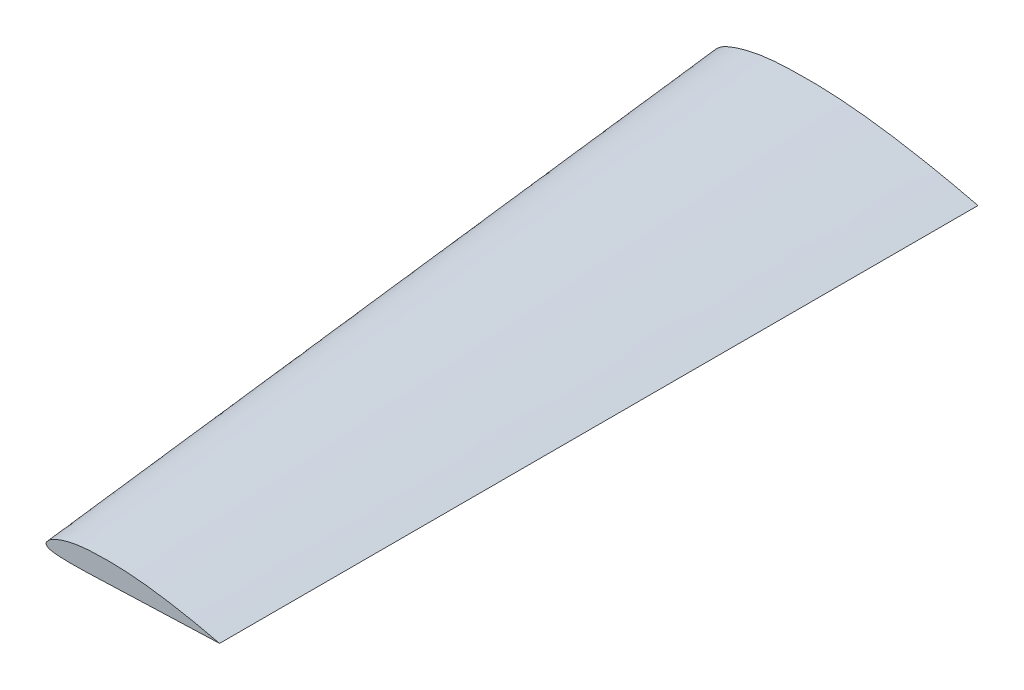
ISO-10303-21;
HEADER;
FILE_DESCRIPTION(('STEP AP214'),'2;1');
FILE_NAME('part.step','',(''),(''),'','','');
FILE_SCHEMA(('AUTOMOTIVE_DESIGN { 1 0 10303 214 1 1 1 1 }'));
ENDSEC;
DATA;
#1=APPLICATION_CONTEXT('core data for automotive mechanical design processes');
#2=APPLICATION_PROTOCOL_DEFINITION('international standard','automotive_design',2000,#1);
#3=PRODUCT_CONTEXT('',#1,'mechanical');
#4=PRODUCT('Part','Part','',(#3));
#5=PRODUCT_RELATED_PRODUCT_CATEGORY('part','',(#4));
#6=PRODUCT_DEFINITION_FORMATION('','',#4);
#7=PRODUCT_DEFINITION_CONTEXT('part definition',#1,'design');
#8=PRODUCT_DEFINITION('design','',#6,#7);
#9=PRODUCT_DEFINITION_SHAPE('','',#8);
#10=(LENGTH_UNIT() NAMED_UNIT(*) SI_UNIT(.MILLI.,.METRE.));
#11=(NAMED_UNIT(*) PLANE_ANGLE_UNIT() SI_UNIT($,.RADIAN.));
#12=(NAMED_UNIT(*) SI_UNIT($,.STERADIAN.) SOLID_ANGLE_UNIT());
#13=UNCERTAINTY_MEASURE_WITH_UNIT(LENGTH_MEASURE(1.E-05),#10,'distance_accuracy_value','');
#14=(GEOMETRIC_REPRESENTATION_CONTEXT(3) GLOBAL_UNCERTAINTY_ASSIGNED_CONTEXT((#13)) GLOBAL_UNIT_ASSIGNED_CONTEXT((#10,
#11,#12)) REPRESENTATION_CONTEXT('',''));
#15=CARTESIAN_POINT('',(0.,0.,0.));
#16=DIRECTION('',(0.,0.,1.));
#17=DIRECTION('',(1.,0.,0.));
#18=AXIS2_PLACEMENT_3D('',#15,#16,#17);
#19=CARTESIAN_POINT('',(114.900829426016,-0.0501642102156497,329.));
#20=DIRECTION('',(0.03670589649599,-0.99932611151837,0.));
#21=DIRECTION('',(-0.99932611151837,-0.03670589649599,0.));
#22=AXIS2_PLACEMENT_3D('',#19,#20,#21);
#23=PLANE('',#22);
#24=DIRECTION('',(-0.99932611151837,-0.03670589649599,0.));
#25=VECTOR('',#24,1.);
#26=CARTESIAN_POINT('',(114.736719522713,-0.056192073447858,329.));
#27=LINE('',#26,#25);
#28=CARTESIAN_POINT('',(114.900829426016,-0.0501642102156497,329.));
#29=VERTEX_POINT('',#28);
#30=CARTESIAN_POINT('',(114.57260961941,-0.0622199366800662,329.));
#31=VERTEX_POINT('',#30);
#32=EDGE_CURVE('E12',#29,#31,#27,.T.);
#33=ORIENTED_EDGE('',*,*,#32,.T.);
#34=DIRECTION('',(-0.00052464922681561,-1.92707065233546E-05,-0.999999862185905));
#35=VECTOR('',#34,1.);
#36=CARTESIAN_POINT('',(114.486304809705,-0.0653899683400331,164.5));
#37=LINE('',#36,#35);
#38=CARTESIAN_POINT('',(114.4,-0.06856,0.));
#39=VERTEX_POINT('',#38);
#40=EDGE_CURVE('E93',#31,#39,#37,.T.);
#41=ORIENTED_EDGE('',*,*,#40,.T.);
#42=DIRECTION('',(-0.99932611151837,-0.0367058964959925,0.));
#43=VECTOR('',#42,1.);
#44=CARTESIAN_POINT('',(114.650414713008,-0.0593621051078248,0.));
#45=LINE('',#44,#43);
#46=CARTESIAN_POINT('',(114.900829426016,-0.0501642102156497,0.));
#47=VERTEX_POINT('',#46);
#48=EDGE_CURVE('E141',#47,#39,#45,.T.);
#49=ORIENTED_EDGE('',*,*,#48,.F.);
#50=DIRECTION('',(0.,0.,-1.));
#51=VECTOR('',#50,1.);
#52=CARTESIAN_POINT('',(114.900829426016,-0.0501642102156497,164.5));
#53=LINE('',#52,#51);
#54=EDGE_CURVE('E123',#29,#47,#53,.T.);
#55=ORIENTED_EDGE('',*,*,#54,.F.);
#56=EDGE_LOOP('',(#33,#41,#49,#55));
#57=FACE_BOUND('',#56,.T.);
#58=ADVANCED_FACE('F82',(#57),#23,.T.);
#59=CARTESIAN_POINT('',(114.57260961941,-0.0622199366800662,329.));
#60=CARTESIAN_POINT('',(114.4,-0.06856,0.));
#61=CARTESIAN_POINT('',(112.977295975491,-0.120816841951953,329.));
#62=CARTESIAN_POINT('',(111.965716629161,-0.157972807713173,0.));
#63=CARTESIAN_POINT('',(109.786644863781,-0.237979796076084,329.));
#64=CARTESIAN_POINT('',(107.097110694278,-0.336751805766281,0.));
#65=CARTESIAN_POINT('',(105.000693099298,-0.413750156151413,329.000000000001));
#66=CARTESIAN_POINT('',(99.7942412380696,-0.604959601121479,0.));
#67=CARTESIAN_POINT('',(100.214728756306,-0.589510986458513,329.));
#68=CARTESIAN_POINT('',(92.4913536383134,-0.8731494297109,0.));
#69=CARTESIAN_POINT('',(96.2264313571632,-0.735983254405373,329.));
#70=CARTESIAN_POINT('',(86.4056226452766,-1.09665710687671,0.));
#71=CARTESIAN_POINT('',(93.0357910844883,-0.85316110543344,329.));
#72=CARTESIAN_POINT('',(81.5370332937189,-1.27545083091915,0.));
#73=CARTESIAN_POINT('',(90.6428111354104,-0.941052950988877,329.));
#74=CARTESIAN_POINT('',(77.885594217603,-1.40956958634636,0.));
#75=CARTESIAN_POINT('',(88.2498328738692,-1.0289616927778,329.));
#76=CARTESIAN_POINT('',(74.2341544850718,-1.5437082159473,0.));
#77=CARTESIAN_POINT('',(85.856852391205,-1.11683664511502,329.));
#78=CARTESIAN_POINT('',(70.5827135432517,-1.67779370490371,0.));
#79=CARTESIAN_POINT('',(83.4638704721177,-1.2046573139067,329.));
#80=CARTESIAN_POINT('',(66.9312695396541,-1.81180573537152,0.));
#81=CARTESIAN_POINT('',(81.0708879975479,-1.29247078457698,329.));
#82=CARTESIAN_POINT('',(63.2798246772732,-1.94578905588669,0.));
#83=CARTESIAN_POINT('',(78.6779074851115,-1.38033351483244,329.));
#84=CARTESIAN_POINT('',(59.6283831410075,-2.07986597687277,0.));
#85=CARTESIAN_POINT('',(76.284934331329,-1.46839890937835,329.));
#86=CARTESIAN_POINT('',(55.9769530860873,-2.21425367726004,0.));
#87=CARTESIAN_POINT('',(73.8919664634316,-1.55660594759836,329.000000000001));
#88=CARTESIAN_POINT('',(52.3255302758724,-2.34883859679651,0.));
#89=CARTESIAN_POINT('',(71.4989899683453,-1.64458072330846,328.999999999999));
#90=CARTESIAN_POINT('',(48.6740949273067,-2.48308328284724,0.));
#91=CARTESIAN_POINT('',(69.105989839964,-1.73190836915481,329.000000000001));
#92=CARTESIAN_POINT('',(45.022623273531,-2.61633760751869,0.));
#93=CARTESIAN_POINT('',(66.7129651493619,-1.81856384168044,328.999999999999));
#94=CARTESIAN_POINT('',(41.3711135439631,-2.74854338410483,0.));
#95=CARTESIAN_POINT('',(64.3199669373025,-1.90594191039954,329.000000000001));
#96=CARTESIAN_POINT('',(37.7196460479609,-2.88191417837728,0.));
#97=CARTESIAN_POINT('',(62.3258668299447,-1.98053661442866,329.));
#98=CARTESIAN_POINT('',(34.6768527696352,-2.99567203272385,0.));
#99=CARTESIAN_POINT('',(60.7306395653596,-2.04158861078398,329.));
#100=CARTESIAN_POINT('',(32.2427036249245,-3.08892865656621,0.));
#101=CARTESIAN_POINT('',(59.5341984389728,-2.0868333620039,329.));
#102=CARTESIAN_POINT('',(30.4170537095853,-3.15787478213016,0.));
#103=CARTESIAN_POINT('',(58.3376895460393,-2.13030150456465,329.));
#104=CARTESIAN_POINT('',(28.5913075746204,-3.22423675912527,0.));
#105=CARTESIAN_POINT('',(57.1410810890218,-2.17088745999478,329.));
#106=CARTESIAN_POINT('',(26.7654048989622,-3.2861862573127,0.));
#107=CARTESIAN_POINT('',(55.9443412703829,-2.20748564982281,329.));
#108=CARTESIAN_POINT('',(24.9393037637721,-3.3420032780021,0.));
#109=CARTESIAN_POINT('',(54.7474529311727,-2.23888966087624,329.));
#110=CARTESIAN_POINT('',(23.1129754350255,-3.38993650770668,0.));
#111=CARTESIAN_POINT('',(53.5504153162138,-2.26397201099151,329.));
#112=CARTESIAN_POINT('',(21.2864190315302,-3.42820995119329,0.));
#113=CARTESIAN_POINT('',(52.353232928687,-2.28124339291768,328.999999999999));
#114=CARTESIAN_POINT('',(19.4596429108321,-3.4545494980358,0.));
#115=CARTESIAN_POINT('',(51.15595355233,-2.288861920351,329.000000000001));
#116=CARTESIAN_POINT('',(17.6327163554305,-3.46619351578578,0.));
#117=CARTESIAN_POINT('',(49.9586406141466,-2.28571853254573,329.));
#118=CARTESIAN_POINT('',(15.8057424311789,-3.46135030596471,0.));
#119=CARTESIAN_POINT('',(48.7614456222737,-2.26913668236569,328.999999999999));
#120=CARTESIAN_POINT('',(13.9789412855685,-3.43617298193985,0.));
#121=CARTESIAN_POINT('',(47.5644880850567,-2.23954580418405,329.000000000001));
#122=CARTESIAN_POINT('',(12.1525159866253,-3.39081697985119,0.));
#123=CARTESIAN_POINT('',(46.3681294391765,-2.19096327836138,328.999999999999));
#124=CARTESIAN_POINT('',(10.3269829850202,-3.31692842661875,0.));
#125=CARTESIAN_POINT('',(45.1723870805993,-2.13077185247814,329.000000000001));
#126=CARTESIAN_POINT('',(8.50241829521622,-3.22500915813475,0.));
#127=CARTESIAN_POINT('',(44.1766473883666,-2.06485136570954,328.999999999999));
#128=CARTESIAN_POINT('',(6.98300428865084,-3.12433212750466,0.));
#129=CARTESIAN_POINT('',(43.3830893437349,-1.97750102636705,329.000000000001));
#130=CARTESIAN_POINT('',(5.77213418222719,-2.99109577573727,0.));
#131=CARTESIAN_POINT('',(42.7903884171788,-1.89255413261195,328.999999999999));
#132=CARTESIAN_POINT('',(4.86771256745936,-2.86147635484054,0.));
#133=CARTESIAN_POINT('',(42.2018621119385,-1.78259761794642,329.000000000001));
#134=CARTESIAN_POINT('',(3.96972156813326,-2.69356724495905,0.));
#135=CARTESIAN_POINT('',(41.6144368512239,-1.66711733291326,328.999999999999));
#136=CARTESIAN_POINT('',(3.07329938019767,-2.5176539368822,0.));
#137=CARTESIAN_POINT('',(41.030721908302,-1.53296410466494,329.000000000001));
#138=CARTESIAN_POINT('',(2.18268391666198,-2.3127837560272,0.));
#139=CARTESIAN_POINT('',(40.5658570608416,-1.34296250191487,328.999999999999));
#140=CARTESIAN_POINT('',(1.47329929331152,-2.02281116106069,0.));
#141=CARTESIAN_POINT('',(40.2328838259331,-1.12111197664618,329.));
#142=CARTESIAN_POINT('',(0.965300946177489,-1.68427874419331,0.));
#143=CARTESIAN_POINT('',(40.0045523416234,-0.926760940944612,329.));
#144=CARTESIAN_POINT('',(0.616853662639164,-1.38773413128347,0.));
#145=CARTESIAN_POINT('',(39.8058884927858,-0.701609182245043,329.));
#146=CARTESIAN_POINT('',(0.313781760209367,-1.04410645837054,0.));
#147=CARTESIAN_POINT('',(39.6506080929225,-0.443706027629307,329.));
#148=CARTESIAN_POINT('',(0.0769541024066916,-0.650538017604325,0.));
#149=CARTESIAN_POINT('',(39.5764905355394,-0.148134503442184,329.));
#150=CARTESIAN_POINT('',(-0.0364245156961572,-0.199715317390292,0.));
#151=CARTESIAN_POINT('',(39.6212379263324,0.152906641389699,329.));
#152=CARTESIAN_POINT('',(0.0320651688817571,0.259740207343021,0.));
#153=CARTESIAN_POINT('',(39.7462731745835,0.426434812966566,329.));
#154=CARTESIAN_POINT('',(0.222717607662432,0.677061995084372,0.));
#155=CARTESIAN_POINT('',(39.9118284437912,0.676489937329452,329.));
#156=CARTESIAN_POINT('',(0.475409900417133,1.05859895915268,0.));
#157=CARTESIAN_POINT('',(40.1020297991035,0.907946183502351,329.));
#158=CARTESIAN_POINT('',(0.765550841982641,1.41183330248373,0.));
#159=CARTESIAN_POINT('',(40.3058904903587,1.12719115072782,329.));
#160=CARTESIAN_POINT('',(1.07673483260303,1.74628416301866,0.));
#161=CARTESIAN_POINT('',(40.5170780992003,1.33935694664796,329.));
#162=CARTESIAN_POINT('',(1.39880128657276,2.07019260086103,0.));
#163=CARTESIAN_POINT('',(40.7305626383487,1.54914088404984,329.));
#164=CARTESIAN_POINT('',(1.72484435432684,2.39003706317112,0.));
#165=CARTESIAN_POINT('',(40.9491748450726,1.75369770525246,329.));
#166=CARTESIAN_POINT('',(2.05806352461083,2.70249872806248,0.));
#167=CARTESIAN_POINT('',(41.2491898335489,2.01693149821586,329.));
#168=CARTESIAN_POINT('',(2.51618795565956,3.10386363754482,0.));
#169=CARTESIAN_POINT('',(41.6433845733717,2.32338414751801,329.));
#170=CARTESIAN_POINT('',(3.11744388388253,3.57170414689077,0.));
#171=CARTESIAN_POINT('',(42.1419159584038,2.65541038243405,329.));
#172=CARTESIAN_POINT('',(3.87827233736804,4.07822471273745,0.));
#173=CARTESIAN_POINT('',(42.6603325762503,2.95527445622198,329.));
#174=CARTESIAN_POINT('',(4.66927623600314,4.53582075141618,0.));
#175=CARTESIAN_POINT('',(43.1920051006209,3.23067304723329,329.));
#176=CARTESIAN_POINT('',(5.48057328365004,4.95603831197717,0.));
#177=CARTESIAN_POINT('',(43.73461712113,3.48384959688034,329.000000000001));
#178=CARTESIAN_POINT('',(6.30853823898846,5.34236268864598,0.));
#179=CARTESIAN_POINT('',(44.2853103695626,3.71876278425974,328.999999999999));
#180=CARTESIAN_POINT('',(7.14883728112551,5.70082045708303,0.));
#181=CARTESIAN_POINT('',(44.842102539349,3.93881445027894,329.));
#182=CARTESIAN_POINT('',(7.99844900100825,6.03659176034702,0.));
#183=CARTESIAN_POINT('',(45.4037436656897,4.14611278204335,329.));
#184=CARTESIAN_POINT('',(8.85544440881743,6.3529290932593,0.));
#185=CARTESIAN_POINT('',(45.9688602827349,4.34370744577013,329.));
#186=CARTESIAN_POINT('',(9.71777798239826,6.65438937250343,0.));
#187=CARTESIAN_POINT('',(46.5371284585512,4.53207887325267,329.));
#188=CARTESIAN_POINT('',(10.5848518324099,6.94191487900306,0.));
#189=CARTESIAN_POINT('',(47.2989015018565,4.77055534918493,329.));
#190=CARTESIAN_POINT('',(11.7472766809127,7.30570333780045,0.));
#191=CARTESIAN_POINT('',(48.2585469423734,5.04413868204417,329.));
#192=CARTESIAN_POINT('',(13.2115681037735,7.72323418873163,0.));
#193=CARTESIAN_POINT('',(49.4194455039909,5.33759135782374,329.));
#194=CARTESIAN_POINT('',(14.9829959141197,8.17097094627978,0.));
#195=CARTESIAN_POINT('',(50.5876889588109,5.60017543141388,329.));
#196=CARTESIAN_POINT('',(16.7656063461902,8.57166989486869,0.));
#197=CARTESIAN_POINT('',(51.7618910786936,5.83463957492898,329.));
#198=CARTESIAN_POINT('',(18.5573221255501,8.92942802521701,0.));
#199=CARTESIAN_POINT('',(52.9413793027427,6.04087523248973,329.));
#200=CARTESIAN_POINT('',(20.357097215315,9.24412694329611,0.));
#201=CARTESIAN_POINT('',(54.1256039736483,6.21798437376885,328.999999999999));
#202=CARTESIAN_POINT('',(22.1641029633317,9.51437922323504,0.));
#203=CARTESIAN_POINT('',(55.7101440829799,6.41328251131465,329.000000000001));
#204=CARTESIAN_POINT('',(24.581947434041,9.81237724369643,0.));
#205=CARTESIAN_POINT('',(57.6983353941993,6.58884014267491,328.999999999999));
#206=CARTESIAN_POINT('',(27.6157220253602,10.0802867880787,0.));
#207=CARTESIAN_POINT('',(60.089648548173,6.7178868839627,329.));
#208=CARTESIAN_POINT('',(31.2646245807487,10.2771026229954,0.));
#209=CARTESIAN_POINT('',(62.4830008435416,6.79713214430168,329.));
#210=CARTESIAN_POINT('',(34.9166302660792,10.3980954427901,0.));
#211=CARTESIAN_POINT('',(64.8771108097576,6.8473589228501,329.));
#212=CARTESIAN_POINT('',(38.5697944561475,10.4747486999319,0.));
#213=CARTESIAN_POINT('',(67.2717857562776,6.85811026179045,329.));
#214=CARTESIAN_POINT('',(42.2238222521298,10.4911444745235,0.));
#215=CARTESIAN_POINT('',(69.6662566295519,6.82456608957842,329.));
#216=CARTESIAN_POINT('',(45.8775382661358,10.4399604287515,0.));
#217=CARTESIAN_POINT('',(72.0595159941657,6.74076018787565,329.));
#218=CARTESIAN_POINT('',(49.5294044274174,10.3120908518743,0.));
#219=CARTESIAN_POINT('',(74.4507854867059,6.61312441778202,329.));
#220=CARTESIAN_POINT('',(53.178236653511,10.1173287938002,0.));
#221=CARTESIAN_POINT('',(76.83962110388,6.44606051592298,329.));
#222=CARTESIAN_POINT('',(56.8233498066736,9.86239123421157,0.));
#223=CARTESIAN_POINT('',(79.2257994806511,6.24485556975728,329.));
#224=CARTESIAN_POINT('',(60.4644197278447,9.55540656456613,0.));
#225=CARTESIAN_POINT('',(81.608883892125,6.00968462430416,329.));
#226=CARTESIAN_POINT('',(64.1007467162242,9.19649996426467,0.));
#227=CARTESIAN_POINT('',(83.9884067169117,5.74098583428185,329.));
#228=CARTESIAN_POINT('',(67.7316796667099,8.78660201096427,0.));
#229=CARTESIAN_POINT('',(86.3639430060132,5.43895442797606,329.));
#230=CARTESIAN_POINT('',(71.35645846618,8.32555431852534,0.));
#231=CARTESIAN_POINT('',(88.7353798020637,5.10654326179853,329.));
#232=CARTESIAN_POINT('',(74.9750949806674,7.81858317834956,0.));
#233=CARTESIAN_POINT('',(91.1029623317014,4.74754064005611,329.));
#234=CARTESIAN_POINT('',(78.587697519638,7.27053006377924,0.));
#235=CARTESIAN_POINT('',(93.4669358215645,4.36573486705565,329.));
#236=CARTESIAN_POINT('',(82.1949389593251,6.68807069894766,0.));
#237=CARTESIAN_POINT('',(96.6140720283502,3.82758553402491,329.));
#238=CARTESIAN_POINT('',(86.9971156579425,5.86690602257278,0.));
#239=CARTESIAN_POINT('',(100.5389082124,3.10287561201863,329.));
#240=CARTESIAN_POINT('',(92.98602152733,4.761034593382,0.));
#241=CARTESIAN_POINT('',(105.23248636945,2.15016018644571,329.));
#242=CARTESIAN_POINT('',(100.147932525585,3.30731157548085,0.));
#243=CARTESIAN_POINT('',(109.912024284167,1.13032636467303,329.));
#244=CARTESIAN_POINT('',(107.288427475213,1.75113882040688,0.));
#245=CARTESIAN_POINT('',(113.019270648536,0.395869046271625,329.));
#246=CARTESIAN_POINT('',(112.029765632302,0.630436336958154,0.));
#247=CARTESIAN_POINT('',(114.600066449668,0.0211332115694607,329.));
#248=CARTESIAN_POINT('',(114.441896278871,0.0586282700306697,0.));
#249=CARTESIAN_POINT('',(114.654664571062,0.00819044402219781,329.));
#250=CARTESIAN_POINT('',(114.525207356504,0.03887894744609,0.));
#251=CARTESIAN_POINT('',(114.736719522714,-0.0112611073904201,329.));
#252=CARTESIAN_POINT('',(114.650414713008,0.00919789489218184,0.));
#253=CARTESIAN_POINT('',(114.818774474365,-0.0307126588030327,329.));
#254=CARTESIAN_POINT('',(114.775622069512,-0.0204831576617346,0.));
#255=CARTESIAN_POINT('',(114.873477775466,-0.0436803597447778,329.));
#256=CARTESIAN_POINT('',(114.859093640515,-0.0402705260310117,0.));
#257=CARTESIAN_POINT('',(114.900829426016,-0.0501642102156497,329.));
#258=CARTESIAN_POINT('',(114.900829426016,-0.0501642102156497,0.));
#259=B_SPLINE_SURFACE_WITH_KNOTS('',3,1,((#59,#60),(#61,#62),(#63,#64),(#65,#66),(#67,#68),(#69,
#70),(#71,#72),(#73,#74),(#75,#76),(#77,#78),(#79,#80),(#81,#82),(#83,#84),(#85,#86),(#87,#88),
(#89,#90),(#91,#92),(#93,#94),(#95,#96),(#97,#98),(#99,#100),(#101,#102),(#103,#104),(#105,
#106),(#107,#108),(#109,#110),(#111,#112),(#113,#114),(#115,#116),(#117,#118),(#119,#120),(#121,
#122),(#123,#124),(#125,#126),(#127,#128),(#129,#130),(#131,#132),(#133,#134),(#135,#136),(#137,
#138),(#139,#140),(#141,#142),(#143,#144),(#145,#146),(#147,#148),(#149,#150),(#151,#152),(#153,
#154),(#155,#156),(#157,#158),(#159,#160),(#161,#162),(#163,#164),(#165,#166),(#167,#168),(#169,
#170),(#171,#172),(#173,#174),(#175,#176),(#177,#178),(#179,#180),(#181,#182),(#183,#184),(#185,
#186),(#187,#188),(#189,#190),(#191,#192),(#193,#194),(#195,#196),(#197,#198),(#199,#200),(#201,
#202),(#203,#204),(#205,#206),(#207,#208),(#209,#210),(#211,#212),(#213,#214),(#215,#216),(#217,
#218),(#219,#220),(#221,#222),(#223,#224),(#225,#226),(#227,#228),(#229,#230),(#231,#232),(#233,
#234),(#235,#236),(#237,#238),(#239,#240),(#241,#242),(#243,#244),(#245,#246),(#247,#248),(#249,
#250),(#251,#252),(#253,#254),(#255,#256),(#257,#258)),.UNSPECIFIED.,.F.,.F.,.F.,(4,1,1,1,1,1,1,
1,1,1,1,1,1,1,1,1,1,1,1,1,1,1,1,1,1,1,1,1,1,1,1,1,1,1,1,1,1,1,1,1,1,1,1,1,1,1,1,1,1,1,1,1,1,1,1,
1,1,1,1,1,1,1,1,1,1,1,1,1,1,1,1,1,1,1,1,1,1,1,1,1,1,1,1,1,1,1,1,1,1,1,1,1,2,1,1,1,4),(2,2),(0.,
0.0311811053211745,0.0623622106423489,0.0935433159635234,0.124724421284698,0.140314973945285,
0.155905526605872,0.17149607926646,0.187086631927047,0.202677184587634,0.218267737248221,
0.233858289908809,0.249448842569396,0.265039395229983,0.28062994789057,0.296220500551158,
0.311811053211745,0.327401605872332,0.342992158532919,0.350787434863213,0.358582711193506,
0.3663779875238,0.374173263854094,0.381968540184387,0.389763816514681,0.397559092844974,
0.405354369175268,0.413149645505562,0.420944921835855,0.428740198166149,0.436535474496443,
0.444330750826736,0.45212602715703,0.459921303487323,0.46381894165247,0.467716579817617,
0.471614217982764,0.475511856147911,0.479409494313058,0.483307132478204,0.485255951560778,
0.487204770643351,0.489153589725925,0.491102408808498,0.493051227891071,0.495000046973645,
0.496948866056218,0.498897685138791,0.500846504221365,0.502795323303939,0.504744142386512,
0.506692961469085,0.508641780551659,0.510590599634232,0.514488237799379,0.518385875964525,
0.522283514129673,0.526181152294819,0.530078790459966,0.533976428625113,0.53787406679026,
0.541771704955407,0.545669343120553,0.5495669812857,0.553464619450847,0.561259895781141,
0.569055172111434,0.576850448441728,0.584645724772021,0.592441001102315,0.600236277432609,
0.608031553762902,0.62362210642349,0.639212659084077,0.654803211744664,0.670393764405251,
0.685984317065839,0.701574869726425,0.717165422387013,0.7327559750476,0.748346527708187,
0.763937080368774,0.779527633029362,0.795118185689949,0.810708738350536,0.826299291011123,
0.841889843671711,0.857480396332298,0.873070948992885,0.90425205431406,0.935433159635234,
0.966614264956409,0.997795370277583,0.998346527708187,0.998897685138791,0.999448842569396,1.),
(0.,1.),.UNSPECIFIED.);
#260=CARTESIAN_POINT('',(114.57260961941,-0.0622199366800662,329.));
#261=CARTESIAN_POINT('',(112.977295975491,-0.120816841951953,329.));
#262=CARTESIAN_POINT('',(109.786644863781,-0.237979796076084,329.));
#263=CARTESIAN_POINT('',(105.000693099298,-0.413750156151413,329.000000000001));
#264=CARTESIAN_POINT('',(100.214728756306,-0.589510986458513,329.));
#265=CARTESIAN_POINT('',(96.2264313571632,-0.735983254405373,329.));
#266=CARTESIAN_POINT('',(93.0357910844883,-0.85316110543344,329.));
#267=CARTESIAN_POINT('',(90.6428111354104,-0.941052950988877,329.));
#268=CARTESIAN_POINT('',(88.2498328738692,-1.0289616927778,329.));
#269=CARTESIAN_POINT('',(85.856852391205,-1.11683664511502,329.));
#270=CARTESIAN_POINT('',(83.4638704721177,-1.2046573139067,329.));
#271=CARTESIAN_POINT('',(81.0708879975479,-1.29247078457698,329.));
#272=CARTESIAN_POINT('',(78.6779074851115,-1.38033351483244,329.));
#273=CARTESIAN_POINT('',(76.284934331329,-1.46839890937835,329.));
#274=CARTESIAN_POINT('',(73.8919664634316,-1.55660594759836,329.000000000001));
#275=CARTESIAN_POINT('',(71.4989899683453,-1.64458072330846,328.999999999999));
#276=CARTESIAN_POINT('',(69.105989839964,-1.73190836915481,329.000000000001));
#277=CARTESIAN_POINT('',(66.7129651493619,-1.81856384168044,328.999999999999));
#278=CARTESIAN_POINT('',(64.3199669373025,-1.90594191039954,329.000000000001));
#279=CARTESIAN_POINT('',(62.3258668299447,-1.98053661442866,329.));
#280=CARTESIAN_POINT('',(60.7306395653596,-2.04158861078398,329.));
#281=CARTESIAN_POINT('',(59.5341984389728,-2.0868333620039,329.));
#282=CARTESIAN_POINT('',(58.3376895460393,-2.13030150456465,329.));
#283=CARTESIAN_POINT('',(57.1410810890218,-2.17088745999478,329.));
#284=CARTESIAN_POINT('',(55.9443412703829,-2.20748564982281,329.));
#285=CARTESIAN_POINT('',(54.7474529311727,-2.23888966087624,329.));
#286=CARTESIAN_POINT('',(53.5504153162138,-2.26397201099151,329.));
#287=CARTESIAN_POINT('',(52.353232928687,-2.28124339291768,328.999999999999));
#288=CARTESIAN_POINT('',(51.15595355233,-2.288861920351,329.000000000001));
#289=CARTESIAN_POINT('',(49.9586406141466,-2.28571853254573,329.));
#290=CARTESIAN_POINT('',(48.7614456222737,-2.26913668236569,328.999999999999));
#291=CARTESIAN_POINT('',(47.5644880850567,-2.23954580418405,329.000000000001));
#292=CARTESIAN_POINT('',(46.3681294391765,-2.19096327836138,328.999999999999));
#293=CARTESIAN_POINT('',(45.1723870805993,-2.13077185247814,329.000000000001));
#294=CARTESIAN_POINT('',(44.1766473883666,-2.06485136570954,328.999999999999));
#295=CARTESIAN_POINT('',(43.3830893437349,-1.97750102636705,329.000000000001));
#296=CARTESIAN_POINT('',(42.7903884171788,-1.89255413261195,328.999999999999));
#297=CARTESIAN_POINT('',(42.2018621119385,-1.78259761794642,329.000000000001));
#298=CARTESIAN_POINT('',(41.6144368512239,-1.66711733291326,328.999999999999));
#299=CARTESIAN_POINT('',(41.030721908302,-1.53296410466494,329.000000000001));
#300=CARTESIAN_POINT('',(40.5658570608416,-1.34296250191487,328.999999999999));
#301=CARTESIAN_POINT('',(40.2328838259331,-1.12111197664618,329.));
#302=CARTESIAN_POINT('',(40.0045523416234,-0.926760940944612,329.));
#303=CARTESIAN_POINT('',(39.8058884927858,-0.701609182245043,329.));
#304=CARTESIAN_POINT('',(39.6506080929225,-0.443706027629307,329.));
#305=CARTESIAN_POINT('',(39.5764905355394,-0.148134503442184,329.));
#306=CARTESIAN_POINT('',(39.6212379263324,0.152906641389699,329.));
#307=CARTESIAN_POINT('',(39.7462731745835,0.426434812966566,329.));
#308=CARTESIAN_POINT('',(39.9118284437912,0.676489937329452,329.));
#309=CARTESIAN_POINT('',(40.1020297991035,0.907946183502351,329.));
#310=CARTESIAN_POINT('',(40.3058904903587,1.12719115072782,329.));
#311=CARTESIAN_POINT('',(40.5170780992003,1.33935694664796,329.));
#312=CARTESIAN_POINT('',(40.7305626383487,1.54914088404984,329.));
#313=CARTESIAN_POINT('',(40.9491748450726,1.75369770525246,329.));
#314=CARTESIAN_POINT('',(41.2491898335489,2.01693149821586,329.));
#315=CARTESIAN_POINT('',(41.6433845733717,2.32338414751801,329.));
#316=CARTESIAN_POINT('',(42.1419159584038,2.65541038243405,329.));
#317=CARTESIAN_POINT('',(42.6603325762503,2.95527445622198,329.));
#318=CARTESIAN_POINT('',(43.1920051006209,3.23067304723329,329.));
#319=CARTESIAN_POINT('',(43.73461712113,3.48384959688034,329.000000000001));
#320=CARTESIAN_POINT('',(44.2853103695626,3.71876278425974,328.999999999999));
#321=CARTESIAN_POINT('',(44.842102539349,3.93881445027894,329.));
#322=CARTESIAN_POINT('',(45.4037436656897,4.14611278204335,329.));
#323=CARTESIAN_POINT('',(45.9688602827349,4.34370744577013,329.));
#324=CARTESIAN_POINT('',(46.5371284585512,4.53207887325267,329.));
#325=CARTESIAN_POINT('',(47.2989015018565,4.77055534918493,329.));
#326=CARTESIAN_POINT('',(48.2585469423734,5.04413868204417,329.));
#327=CARTESIAN_POINT('',(49.4194455039909,5.33759135782374,329.));
#328=CARTESIAN_POINT('',(50.5876889588109,5.60017543141388,329.));
#329=CARTESIAN_POINT('',(51.7618910786936,5.83463957492898,329.));
#330=CARTESIAN_POINT('',(52.9413793027427,6.04087523248973,329.));
#331=CARTESIAN_POINT('',(54.1256039736483,6.21798437376885,328.999999999999));
#332=CARTESIAN_POINT('',(55.7101440829799,6.41328251131465,329.000000000001));
#333=CARTESIAN_POINT('',(57.6983353941993,6.58884014267491,328.999999999999));
#334=CARTESIAN_POINT('',(60.089648548173,6.7178868839627,329.));
#335=CARTESIAN_POINT('',(62.4830008435416,6.79713214430168,329.));
#336=CARTESIAN_POINT('',(64.8771108097576,6.8473589228501,329.));
#337=CARTESIAN_POINT('',(67.2717857562776,6.85811026179045,329.));
#338=CARTESIAN_POINT('',(69.6662566295519,6.82456608957842,329.));
#339=CARTESIAN_POINT('',(72.0595159941657,6.74076018787565,329.));
#340=CARTESIAN_POINT('',(74.4507854867059,6.61312441778202,329.));
#341=CARTESIAN_POINT('',(76.83962110388,6.44606051592298,329.));
#342=CARTESIAN_POINT('',(79.2257994806511,6.24485556975728,329.));
#343=CARTESIAN_POINT('',(81.608883892125,6.00968462430416,329.));
#344=CARTESIAN_POINT('',(83.9884067169117,5.74098583428185,329.));
#345=CARTESIAN_POINT('',(86.3639430060132,5.43895442797606,329.));
#346=CARTESIAN_POINT('',(88.7353798020637,5.10654326179853,329.));
#347=CARTESIAN_POINT('',(91.1029623317014,4.74754064005611,329.));
#348=CARTESIAN_POINT('',(93.4669358215645,4.36573486705565,329.));
#349=CARTESIAN_POINT('',(96.6140720283502,3.82758553402491,329.));
#350=CARTESIAN_POINT('',(100.5389082124,3.10287561201863,329.));
#351=CARTESIAN_POINT('',(105.23248636945,2.15016018644571,329.));
#352=CARTESIAN_POINT('',(109.912024284167,1.13032636467303,329.));
#353=CARTESIAN_POINT('',(113.019270648536,0.395869046271625,329.));
#354=CARTESIAN_POINT('',(114.600066449668,0.0211332115694607,329.));
#355=CARTESIAN_POINT('',(114.654664571062,0.00819044402219781,329.));
#356=CARTESIAN_POINT('',(114.736719522714,-0.0112611073904201,329.));
#357=CARTESIAN_POINT('',(114.818774474365,-0.0307126588030327,329.));
#358=CARTESIAN_POINT('',(114.873477775466,-0.0436803597447778,329.));
#359=CARTESIAN_POINT('',(114.900829426016,-0.0501642102156497,329.));
#360=B_SPLINE_CURVE_WITH_KNOTS('',3,(#260,#261,#262,#263,#264,#265,#266,#267,#268,#269,#270,
#271,#272,#273,#274,#275,#276,#277,#278,#279,#280,#281,#282,#283,#284,#285,#286,#287,#288,#289,
#290,#291,#292,#293,#294,#295,#296,#297,#298,#299,#300,#301,#302,#303,#304,#305,#306,#307,#308,
#309,#310,#311,#312,#313,#314,#315,#316,#317,#318,#319,#320,#321,#322,#323,#324,#325,#326,#327,
#328,#329,#330,#331,#332,#333,#334,#335,#336,#337,#338,#339,#340,#341,#342,#343,#344,#345,#346,
#347,#348,#349,#350,#351,#352,#353,#354,#355,#356,#357,#358,#359),.UNSPECIFIED.,.F.,.F.,(4,1,1,
1,1,1,1,1,1,1,1,1,1,1,1,1,1,1,1,1,1,1,1,1,1,1,1,1,1,1,1,1,1,1,1,1,1,1,1,1,1,1,1,1,1,1,1,1,1,1,1,
1,1,1,1,1,1,1,1,1,1,1,1,1,1,1,1,1,1,1,1,1,1,1,1,1,1,1,1,1,1,1,1,1,1,1,1,1,1,1,1,1,2,1,1,1,4),
(0.,0.0311811053211745,0.0623622106423489,0.0935433159635234,0.124724421284698,
0.140314973945285,0.155905526605872,0.17149607926646,0.187086631927047,0.202677184587634,
0.218267737248221,0.233858289908809,0.249448842569396,0.265039395229983,0.28062994789057,
0.296220500551158,0.311811053211745,0.327401605872332,0.342992158532919,0.350787434863213,
0.358582711193506,0.3663779875238,0.374173263854094,0.381968540184387,0.389763816514681,
0.397559092844974,0.405354369175268,0.413149645505562,0.420944921835855,0.428740198166149,
0.436535474496443,0.444330750826736,0.45212602715703,0.459921303487323,0.46381894165247,
0.467716579817617,0.471614217982764,0.475511856147911,0.479409494313058,0.483307132478204,
0.485255951560778,0.487204770643351,0.489153589725925,0.491102408808498,0.493051227891071,
0.495000046973645,0.496948866056218,0.498897685138791,0.500846504221365,0.502795323303939,
0.504744142386512,0.506692961469085,0.508641780551659,0.510590599634232,0.514488237799379,
0.518385875964525,0.522283514129673,0.526181152294819,0.530078790459966,0.533976428625113,
0.53787406679026,0.541771704955407,0.545669343120553,0.5495669812857,0.553464619450847,
0.561259895781141,0.569055172111434,0.576850448441728,0.584645724772021,0.592441001102315,
0.600236277432609,0.608031553762902,0.62362210642349,0.639212659084077,0.654803211744664,
0.670393764405251,0.685984317065839,0.701574869726425,0.717165422387013,0.7327559750476,
0.748346527708187,0.763937080368774,0.779527633029362,0.795118185689949,0.810708738350536,
0.826299291011123,0.841889843671711,0.857480396332298,0.873070948992885,0.90425205431406,
0.935433159635234,0.966614264956409,0.997795370277583,0.998346527708187,0.998897685138791,
0.999448842569396,1.),.UNSPECIFIED.);
#361=CARTESIAN_POINT('',(114.572609618683,0.027641995607248,329.));
#362=VERTEX_POINT('',#361);
#363=EDGE_CURVE('E126',#31,#362,#360,.T.);
#364=DIRECTION('',(0.97303377141832,-0.230662696766167,0.));
#365=VECTOR('',#364,1.);
#366=CARTESIAN_POINT('',(114.57260961941,0.0276419954348088,329.));
#367=LINE('',#366,#365);
#368=EDGE_CURVE('E110',#362,#29,#367,.T.);
#369=DIRECTION('',(0.973033771418316,-0.230662696766182,0.));
#370=VECTOR('',#369,1.);
#371=CARTESIAN_POINT('',(114.4,0.06856,0.));
#372=LINE('',#371,#370);
#373=CARTESIAN_POINT('',(114.39999999889,0.0685600002631364,0.));
#374=VERTEX_POINT('',#373);
#375=EDGE_CURVE('E101',#374,#47,#372,.T.);
#376=CARTESIAN_POINT('',(114.4,-0.06856,0.));
#377=CARTESIAN_POINT('',(111.965716629161,-0.157972807713173,0.));
#378=CARTESIAN_POINT('',(107.097110694278,-0.336751805766281,0.));
#379=CARTESIAN_POINT('',(99.7942412380696,-0.604959601121479,0.));
#380=CARTESIAN_POINT('',(92.4913536383134,-0.8731494297109,0.));
#381=CARTESIAN_POINT('',(86.4056226452766,-1.09665710687671,0.));
#382=CARTESIAN_POINT('',(81.5370332937189,-1.27545083091915,0.));
#383=CARTESIAN_POINT('',(77.885594217603,-1.40956958634636,0.));
#384=CARTESIAN_POINT('',(74.2341544850718,-1.5437082159473,0.));
#385=CARTESIAN_POINT('',(70.5827135432517,-1.67779370490371,0.));
#386=CARTESIAN_POINT('',(66.9312695396541,-1.81180573537152,0.));
#387=CARTESIAN_POINT('',(63.2798246772732,-1.94578905588669,0.));
#388=CARTESIAN_POINT('',(59.6283831410075,-2.07986597687277,0.));
#389=CARTESIAN_POINT('',(55.9769530860873,-2.21425367726004,0.));
#390=CARTESIAN_POINT('',(52.3255302758724,-2.34883859679651,0.));
#391=CARTESIAN_POINT('',(48.6740949273067,-2.48308328284724,0.));
#392=CARTESIAN_POINT('',(45.022623273531,-2.61633760751869,0.));
#393=CARTESIAN_POINT('',(41.3711135439631,-2.74854338410483,0.));
#394=CARTESIAN_POINT('',(37.7196460479609,-2.88191417837728,0.));
#395=CARTESIAN_POINT('',(34.6768527696352,-2.99567203272385,0.));
#396=CARTESIAN_POINT('',(32.2427036249245,-3.08892865656621,0.));
#397=CARTESIAN_POINT('',(30.4170537095853,-3.15787478213016,0.));
#398=CARTESIAN_POINT('',(28.5913075746204,-3.22423675912527,0.));
#399=CARTESIAN_POINT('',(26.7654048989622,-3.2861862573127,0.));
#400=CARTESIAN_POINT('',(24.9393037637721,-3.3420032780021,0.));
#401=CARTESIAN_POINT('',(23.1129754350255,-3.38993650770668,0.));
#402=CARTESIAN_POINT('',(21.2864190315302,-3.42820995119329,0.));
#403=CARTESIAN_POINT('',(19.4596429108321,-3.4545494980358,0.));
#404=CARTESIAN_POINT('',(17.6327163554305,-3.46619351578578,0.));
#405=CARTESIAN_POINT('',(15.8057424311789,-3.46135030596471,0.));
#406=CARTESIAN_POINT('',(13.9789412855685,-3.43617298193985,0.));
#407=CARTESIAN_POINT('',(12.1525159866253,-3.39081697985119,0.));
#408=CARTESIAN_POINT('',(10.3269829850202,-3.31692842661875,0.));
#409=CARTESIAN_POINT('',(8.50241829521622,-3.22500915813475,0.));
#410=CARTESIAN_POINT('',(6.98300428865084,-3.12433212750466,0.));
#411=CARTESIAN_POINT('',(5.77213418222719,-2.99109577573727,0.));
#412=CARTESIAN_POINT('',(4.86771256745936,-2.86147635484054,0.));
#413=CARTESIAN_POINT('',(3.96972156813326,-2.69356724495905,0.));
#414=CARTESIAN_POINT('',(3.07329938019767,-2.5176539368822,0.));
#415=CARTESIAN_POINT('',(2.18268391666198,-2.3127837560272,0.));
#416=CARTESIAN_POINT('',(1.47329929331152,-2.02281116106069,0.));
#417=CARTESIAN_POINT('',(0.965300946177489,-1.68427874419331,0.));
#418=CARTESIAN_POINT('',(0.616853662639164,-1.38773413128347,0.));
#419=CARTESIAN_POINT('',(0.313781760209367,-1.04410645837054,0.));
#420=CARTESIAN_POINT('',(0.0769541024066916,-0.650538017604325,0.));
#421=CARTESIAN_POINT('',(-0.0364245156961572,-0.199715317390292,0.));
#422=CARTESIAN_POINT('',(0.0320651688817571,0.259740207343021,0.));
#423=CARTESIAN_POINT('',(0.222717607662432,0.677061995084372,0.));
#424=CARTESIAN_POINT('',(0.475409900417133,1.05859895915268,0.));
#425=CARTESIAN_POINT('',(0.765550841982641,1.41183330248373,0.));
#426=CARTESIAN_POINT('',(1.07673483260303,1.74628416301866,0.));
#427=CARTESIAN_POINT('',(1.39880128657276,2.07019260086103,0.));
#428=CARTESIAN_POINT('',(1.72484435432684,2.39003706317112,0.));
#429=CARTESIAN_POINT('',(2.05806352461083,2.70249872806248,0.));
#430=CARTESIAN_POINT('',(2.51618795565956,3.10386363754482,0.));
#431=CARTESIAN_POINT('',(3.11744388388253,3.57170414689077,0.));
#432=CARTESIAN_POINT('',(3.87827233736804,4.07822471273745,0.));
#433=CARTESIAN_POINT('',(4.66927623600314,4.53582075141618,0.));
#434=CARTESIAN_POINT('',(5.48057328365004,4.95603831197717,0.));
#435=CARTESIAN_POINT('',(6.30853823898846,5.34236268864598,0.));
#436=CARTESIAN_POINT('',(7.14883728112551,5.70082045708303,0.));
#437=CARTESIAN_POINT('',(7.99844900100825,6.03659176034702,0.));
#438=CARTESIAN_POINT('',(8.85544440881743,6.3529290932593,0.));
#439=CARTESIAN_POINT('',(9.71777798239826,6.65438937250343,0.));
#440=CARTESIAN_POINT('',(10.5848518324099,6.94191487900306,0.));
#441=CARTESIAN_POINT('',(11.7472766809127,7.30570333780045,0.));
#442=CARTESIAN_POINT('',(13.2115681037735,7.72323418873163,0.));
#443=CARTESIAN_POINT('',(14.9829959141197,8.17097094627978,0.));
#444=CARTESIAN_POINT('',(16.7656063461902,8.57166989486869,0.));
#445=CARTESIAN_POINT('',(18.5573221255501,8.92942802521701,0.));
#446=CARTESIAN_POINT('',(20.357097215315,9.24412694329611,0.));
#447=CARTESIAN_POINT('',(22.1641029633317,9.51437922323504,0.));
#448=CARTESIAN_POINT('',(24.581947434041,9.81237724369643,0.));
#449=CARTESIAN_POINT('',(27.6157220253602,10.0802867880787,0.));
#450=CARTESIAN_POINT('',(31.2646245807487,10.2771026229954,0.));
#451=CARTESIAN_POINT('',(34.9166302660792,10.3980954427901,0.));
#452=CARTESIAN_POINT('',(38.5697944561475,10.4747486999319,0.));
#453=CARTESIAN_POINT('',(42.2238222521298,10.4911444745235,0.));
#454=CARTESIAN_POINT('',(45.8775382661358,10.4399604287515,0.));
#455=CARTESIAN_POINT('',(49.5294044274174,10.3120908518743,0.));
#456=CARTESIAN_POINT('',(53.178236653511,10.1173287938002,0.));
#457=CARTESIAN_POINT('',(56.8233498066736,9.86239123421157,0.));
#458=CARTESIAN_POINT('',(60.4644197278447,9.55540656456613,0.));
#459=CARTESIAN_POINT('',(64.1007467162242,9.19649996426467,0.));
#460=CARTESIAN_POINT('',(67.7316796667099,8.78660201096427,0.));
#461=CARTESIAN_POINT('',(71.35645846618,8.32555431852534,0.));
#462=CARTESIAN_POINT('',(74.9750949806674,7.81858317834956,0.));
#463=CARTESIAN_POINT('',(78.587697519638,7.27053006377924,0.));
#464=CARTESIAN_POINT('',(82.1949389593251,6.68807069894766,0.));
#465=CARTESIAN_POINT('',(86.9971156579425,5.86690602257278,0.));
#466=CARTESIAN_POINT('',(92.98602152733,4.761034593382,0.));
#467=CARTESIAN_POINT('',(100.147932525585,3.30731157548085,0.));
#468=CARTESIAN_POINT('',(107.288427475213,1.75113882040688,0.));
#469=CARTESIAN_POINT('',(112.029765632302,0.630436336958154,0.));
#470=CARTESIAN_POINT('',(114.441896278871,0.0586282700306697,0.));
#471=CARTESIAN_POINT('',(114.525207356504,0.03887894744609,0.));
#472=CARTESIAN_POINT('',(114.650414713008,0.00919789489218184,0.));
#473=CARTESIAN_POINT('',(114.775622069512,-0.0204831576617346,0.));
#474=CARTESIAN_POINT('',(114.859093640515,-0.0402705260310117,0.));
#475=CARTESIAN_POINT('',(114.900829426016,-0.0501642102156497,0.));
#476=B_SPLINE_CURVE_WITH_KNOTS('',3,(#376,#377,#378,#379,#380,#381,#382,#383,#384,#385,#386,
#387,#388,#389,#390,#391,#392,#393,#394,#395,#396,#397,#398,#399,#400,#401,#402,#403,#404,#405,
#406,#407,#408,#409,#410,#411,#412,#413,#414,#415,#416,#417,#418,#419,#420,#421,#422,#423,#424,
#425,#426,#427,#428,#429,#430,#431,#432,#433,#434,#435,#436,#437,#438,#439,#440,#441,#442,#443,
#444,#445,#446,#447,#448,#449,#450,#451,#452,#453,#454,#455,#456,#457,#458,#459,#460,#461,#462,
#463,#464,#465,#466,#467,#468,#469,#470,#471,#472,#473,#474,#475),.UNSPECIFIED.,.F.,.F.,(4,1,1,
1,1,1,1,1,1,1,1,1,1,1,1,1,1,1,1,1,1,1,1,1,1,1,1,1,1,1,1,1,1,1,1,1,1,1,1,1,1,1,1,1,1,1,1,1,1,1,1,
1,1,1,1,1,1,1,1,1,1,1,1,1,1,1,1,1,1,1,1,1,1,1,1,1,1,1,1,1,1,1,1,1,1,1,1,1,1,1,1,1,2,1,1,1,4),
(0.,0.0311811053211745,0.0623622106423489,0.0935433159635234,0.124724421284698,
0.140314973945285,0.155905526605872,0.17149607926646,0.187086631927047,0.202677184587634,
0.218267737248221,0.233858289908809,0.249448842569396,0.265039395229983,0.28062994789057,
0.296220500551158,0.311811053211745,0.327401605872332,0.342992158532919,0.350787434863213,
0.358582711193506,0.3663779875238,0.374173263854094,0.381968540184387,0.389763816514681,
0.397559092844974,0.405354369175268,0.413149645505562,0.420944921835855,0.428740198166149,
0.436535474496443,0.444330750826736,0.45212602715703,0.459921303487323,0.46381894165247,
0.467716579817617,0.471614217982764,0.475511856147911,0.479409494313058,0.483307132478204,
0.485255951560778,0.487204770643351,0.489153589725925,0.491102408808498,0.493051227891071,
0.495000046973645,0.496948866056218,0.498897685138791,0.500846504221365,0.502795323303939,
0.504744142386512,0.506692961469085,0.508641780551659,0.510590599634232,0.514488237799379,
0.518385875964525,0.522283514129673,0.526181152294819,0.530078790459966,0.533976428625113,
0.53787406679026,0.541771704955407,0.545669343120553,0.5495669812857,0.553464619450847,
0.561259895781141,0.569055172111434,0.576850448441728,0.584645724772021,0.592441001102315,
0.600236277432609,0.608031553762902,0.62362210642349,0.639212659084077,0.654803211744664,
0.670393764405251,0.685984317065839,0.701574869726425,0.717165422387013,0.7327559750476,
0.748346527708187,0.763937080368774,0.779527633029362,0.795118185689949,0.810708738350536,
0.826299291011123,0.841889843671711,0.857480396332298,0.873070948992885,0.90425205431406,
0.935433159635234,0.966614264956409,0.997795370277583,0.998346527708187,0.998897685138791,
0.999448842569396,1.),.UNSPECIFIED.);
#477=EDGE_CURVE('E186',#39,#374,#476,.T.);
#478=ORIENTED_EDGE('',*,*,#363,.T.);
#479=ORIENTED_EDGE('',*,*,#368,.T.);
#480=ORIENTED_EDGE('',*,*,#54,.T.);
#481=ORIENTED_EDGE('',*,*,#375,.F.);
#482=ORIENTED_EDGE('',*,*,#477,.F.);
#483=ORIENTED_EDGE('',*,*,#40,.F.);
#484=EDGE_LOOP('',(#478,#479,#480,#481,#482,#483));
#485=FACE_BOUND('',#484,.T.);
#486=ADVANCED_FACE('F121',(#485),#259,.T.);
#487=CARTESIAN_POINT('',(40.020161085699,0.806786694725448,329.));
#488=DIRECTION('',(-4.49796908122171E-10,1.22458198294049E-08,1.));
#489=DIRECTION('',(0.,-1.,1.22458198294049E-08));
#490=AXIS2_PLACEMENT_3D('',#487,#488,#489);
#491=PLANE('',#490);
#492=ORIENTED_EDGE('',*,*,#363,.F.);
#493=ORIENTED_EDGE('',*,*,#32,.F.);
#494=ORIENTED_EDGE('',*,*,#368,.F.);
#495=EDGE_LOOP('',(#492,#493,#494));
#496=FACE_BOUND('',#495,.T.);
#497=ADVANCED_FACE('F131',(#496),#491,.T.);
#498=CARTESIAN_POINT('',(0.640669166447432,1.25744656086424,0.));
#499=DIRECTION('',(0.,0.,1.));
#500=DIRECTION('',(1.,0.,0.));
#501=AXIS2_PLACEMENT_3D('',#498,#499,#500);
#502=PLANE('',#501);
#503=ORIENTED_EDGE('',*,*,#48,.T.);
#504=ORIENTED_EDGE('',*,*,#477,.T.);
#505=ORIENTED_EDGE('',*,*,#375,.T.);
#506=EDGE_LOOP('',(#503,#504,#505));
#507=FACE_BOUND('',#506,.T.);
#508=ADVANCED_FACE('F161',(#507),#502,.F.);
#509=CLOSED_SHELL('',(#58,#486,#497,#508));
#510=MANIFOLD_SOLID_BREP('B2',#509);
#511=ADVANCED_BREP_SHAPE_REPRESENTATION('',(#18,#510),#14);
#512=SHAPE_DEFINITION_REPRESENTATION(#9,#511);
ENDSEC;
END-ISO-10303-21;
